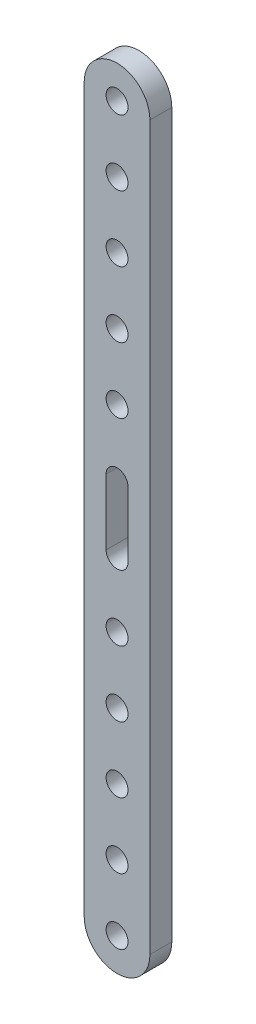
ISO-10303-21;
HEADER;
FILE_DESCRIPTION(('STEP AP214'),'2;1');
FILE_NAME('part.step','',(''),(''),'','','');
FILE_SCHEMA(('AUTOMOTIVE_DESIGN { 1 0 10303 214 1 1 1 1 }'));
ENDSEC;
DATA;
#1=APPLICATION_CONTEXT('core data for automotive mechanical design processes');
#2=APPLICATION_PROTOCOL_DEFINITION('international standard','automotive_design',2000,#1);
#3=PRODUCT_CONTEXT('',#1,'mechanical');
#4=PRODUCT('Part','Part','',(#3));
#5=PRODUCT_RELATED_PRODUCT_CATEGORY('part','',(#4));
#6=PRODUCT_DEFINITION_FORMATION('','',#4);
#7=PRODUCT_DEFINITION_CONTEXT('part definition',#1,'design');
#8=PRODUCT_DEFINITION('design','',#6,#7);
#9=PRODUCT_DEFINITION_SHAPE('','',#8);
#10=(LENGTH_UNIT() NAMED_UNIT(*) SI_UNIT(.MILLI.,.METRE.));
#11=(NAMED_UNIT(*) PLANE_ANGLE_UNIT() SI_UNIT($,.RADIAN.));
#12=(NAMED_UNIT(*) SI_UNIT($,.STERADIAN.) SOLID_ANGLE_UNIT());
#13=UNCERTAINTY_MEASURE_WITH_UNIT(LENGTH_MEASURE(1.E-05),#10,'distance_accuracy_value','');
#14=(GEOMETRIC_REPRESENTATION_CONTEXT(3) GLOBAL_UNCERTAINTY_ASSIGNED_CONTEXT((#13)) GLOBAL_UNIT_ASSIGNED_CONTEXT((#10,
#11,#12)) REPRESENTATION_CONTEXT('',''));
#15=CARTESIAN_POINT('',(0.,0.,0.));
#16=DIRECTION('',(0.,0.,1.));
#17=DIRECTION('',(1.,0.,0.));
#18=AXIS2_PLACEMENT_3D('',#15,#16,#17);
#19=CARTESIAN_POINT('',(208.7507761496,89.428489513,3.));
#20=DIRECTION('',(0.,0.,1.));
#21=DIRECTION('',(1.,0.,0.));
#22=AXIS2_PLACEMENT_3D('',#19,#20,#21);
#23=PLANE('',#22);
#24=CARTESIAN_POINT('',(208.7507761496,107.428489513,3.));
#25=DIRECTION('',(0.,0.,1.));
#26=DIRECTION('',(1.,0.,0.));
#27=AXIS2_PLACEMENT_3D('',#24,#25,#26);
#28=CIRCLE('',#27,1.5);
#29=CARTESIAN_POINT('',(210.2507761496,107.428489513,3.));
#30=VERTEX_POINT('',#29);
#31=EDGE_CURVE('E134',#30,#30,#28,.T.);
#32=ORIENTED_EDGE('',*,*,#31,.F.);
#33=EDGE_LOOP('',(#32));
#34=FACE_BOUND('',#33,.T.);
#35=CARTESIAN_POINT('',(208.7507761496,89.428489513,3.));
#36=DIRECTION('',(0.,0.,1.));
#37=DIRECTION('',(1.,0.,0.));
#38=AXIS2_PLACEMENT_3D('',#35,#36,#37);
#39=CIRCLE('',#38,1.5);
#40=CARTESIAN_POINT('',(210.2507761496,89.428489513,3.));
#41=VERTEX_POINT('',#40);
#42=EDGE_CURVE('E146',#41,#41,#39,.T.);
#43=ORIENTED_EDGE('',*,*,#42,.F.);
#44=EDGE_LOOP('',(#43));
#45=FACE_BOUND('',#44,.T.);
#46=CARTESIAN_POINT('',(208.7507761496,116.428489513,3.));
#47=DIRECTION('',(0.,0.,1.));
#48=DIRECTION('',(1.,0.,0.));
#49=AXIS2_PLACEMENT_3D('',#46,#47,#48);
#50=CIRCLE('',#49,1.5);
#51=CARTESIAN_POINT('',(210.2507761496,116.428489513,3.));
#52=VERTEX_POINT('',#51);
#53=EDGE_CURVE('E158',#52,#52,#50,.T.);
#54=ORIENTED_EDGE('',*,*,#53,.F.);
#55=EDGE_LOOP('',(#54));
#56=FACE_BOUND('',#55,.T.);
#57=CARTESIAN_POINT('',(208.7507761496,161.428489513,3.));
#58=DIRECTION('',(0.,0.,1.));
#59=DIRECTION('',(1.,0.,0.));
#60=AXIS2_PLACEMENT_3D('',#57,#58,#59);
#61=CIRCLE('',#60,1.5);
#62=CARTESIAN_POINT('',(210.2507761496,161.428489513,3.));
#63=VERTEX_POINT('',#62);
#64=EDGE_CURVE('E170',#63,#63,#61,.T.);
#65=ORIENTED_EDGE('',*,*,#64,.F.);
#66=EDGE_LOOP('',(#65));
#67=FACE_BOUND('',#66,.T.);
#68=CARTESIAN_POINT('',(208.7507761496,188.428489513,3.));
#69=DIRECTION('',(0.,0.,1.));
#70=DIRECTION('',(1.,0.,0.));
#71=AXIS2_PLACEMENT_3D('',#68,#69,#70);
#72=CIRCLE('',#71,1.5);
#73=CARTESIAN_POINT('',(210.2507761496,188.428489513,3.));
#74=VERTEX_POINT('',#73);
#75=EDGE_CURVE('E182',#74,#74,#72,.T.);
#76=ORIENTED_EDGE('',*,*,#75,.F.);
#77=EDGE_LOOP('',(#76));
#78=FACE_BOUND('',#77,.T.);
#79=CARTESIAN_POINT('',(208.7507761496,89.428489513,3.));
#80=DIRECTION('',(0.,0.,1.));
#81=DIRECTION('',(1.,0.,0.));
#82=AXIS2_PLACEMENT_3D('',#79,#80,#81);
#83=CIRCLE('',#82,4.5);
#84=CARTESIAN_POINT('',(204.2507761496,89.428489513,3.));
#85=VERTEX_POINT('',#84);
#86=CARTESIAN_POINT('',(213.2507761496,89.428489513,3.));
#87=VERTEX_POINT('',#86);
#88=EDGE_CURVE('E194',#85,#87,#83,.T.);
#89=ORIENTED_EDGE('',*,*,#88,.T.);
#90=DIRECTION('',(0.,1.,0.));
#91=VECTOR('',#90,1.);
#92=CARTESIAN_POINT('',(213.2507761496,89.428489513,3.));
#93=LINE('',#92,#91);
#94=CARTESIAN_POINT('',(213.2507761496,188.428489513,3.));
#95=VERTEX_POINT('',#94);
#96=EDGE_CURVE('E197',#87,#95,#93,.T.);
#97=ORIENTED_EDGE('',*,*,#96,.T.);
#98=CARTESIAN_POINT('',(208.7507761496,188.428489513,3.));
#99=DIRECTION('',(0.,0.,1.));
#100=DIRECTION('',(1.,0.,0.));
#101=AXIS2_PLACEMENT_3D('',#98,#99,#100);
#102=CIRCLE('',#101,4.5);
#103=CARTESIAN_POINT('',(204.2507761496,188.428489513,3.));
#104=VERTEX_POINT('',#103);
#105=EDGE_CURVE('E200',#95,#104,#102,.T.);
#106=ORIENTED_EDGE('',*,*,#105,.T.);
#107=DIRECTION('',(0.,-1.,0.));
#108=VECTOR('',#107,1.);
#109=CARTESIAN_POINT('',(204.2507761496,188.428489513,3.));
#110=LINE('',#109,#108);
#111=EDGE_CURVE('E202',#104,#85,#110,.T.);
#112=ORIENTED_EDGE('',*,*,#111,.T.);
#113=EDGE_LOOP('',(#89,#97,#106,#112));
#114=FACE_BOUND('',#113,.T.);
#115=CARTESIAN_POINT('',(208.7507761496,179.428489513,3.));
#116=DIRECTION('',(0.,0.,1.));
#117=DIRECTION('',(1.,0.,0.));
#118=AXIS2_PLACEMENT_3D('',#115,#116,#117);
#119=CIRCLE('',#118,1.5);
#120=CARTESIAN_POINT('',(210.2507761496,179.428489513,3.));
#121=VERTEX_POINT('',#120);
#122=EDGE_CURVE('E188',#121,#121,#119,.T.);
#123=ORIENTED_EDGE('',*,*,#122,.F.);
#124=EDGE_LOOP('',(#123));
#125=FACE_BOUND('',#124,.T.);
#126=CARTESIAN_POINT('',(208.7507761496,152.428489513,3.));
#127=DIRECTION('',(0.,0.,1.));
#128=DIRECTION('',(1.,0.,0.));
#129=AXIS2_PLACEMENT_3D('',#126,#127,#128);
#130=CIRCLE('',#129,1.5);
#131=CARTESIAN_POINT('',(210.2507761496,152.428489513,3.));
#132=VERTEX_POINT('',#131);
#133=EDGE_CURVE('E176',#132,#132,#130,.T.);
#134=ORIENTED_EDGE('',*,*,#133,.F.);
#135=EDGE_LOOP('',(#134));
#136=FACE_BOUND('',#135,.T.);
#137=CARTESIAN_POINT('',(208.7507761496,170.428489513,3.));
#138=DIRECTION('',(0.,0.,1.));
#139=DIRECTION('',(1.,0.,0.));
#140=AXIS2_PLACEMENT_3D('',#137,#138,#139);
#141=CIRCLE('',#140,1.5);
#142=CARTESIAN_POINT('',(210.2507761496,170.428489513,3.));
#143=VERTEX_POINT('',#142);
#144=EDGE_CURVE('E164',#143,#143,#141,.T.);
#145=ORIENTED_EDGE('',*,*,#144,.F.);
#146=EDGE_LOOP('',(#145));
#147=FACE_BOUND('',#146,.T.);
#148=CARTESIAN_POINT('',(208.7507761496,125.428489513,3.));
#149=DIRECTION('',(0.,0.,1.));
#150=DIRECTION('',(1.,0.,0.));
#151=AXIS2_PLACEMENT_3D('',#148,#149,#150);
#152=CIRCLE('',#151,1.5);
#153=CARTESIAN_POINT('',(210.2507761496,125.428489513,3.));
#154=VERTEX_POINT('',#153);
#155=EDGE_CURVE('E152',#154,#154,#152,.T.);
#156=ORIENTED_EDGE('',*,*,#155,.F.);
#157=EDGE_LOOP('',(#156));
#158=FACE_BOUND('',#157,.T.);
#159=CARTESIAN_POINT('',(208.7507761496,98.428489513,3.));
#160=DIRECTION('',(0.,0.,1.));
#161=DIRECTION('',(1.,0.,0.));
#162=AXIS2_PLACEMENT_3D('',#159,#160,#161);
#163=CIRCLE('',#162,1.5);
#164=CARTESIAN_POINT('',(210.2507761496,98.428489513,3.));
#165=VERTEX_POINT('',#164);
#166=EDGE_CURVE('E140',#165,#165,#163,.T.);
#167=ORIENTED_EDGE('',*,*,#166,.F.);
#168=EDGE_LOOP('',(#167));
#169=FACE_BOUND('',#168,.T.);
#170=DIRECTION('',(0.,1.,0.));
#171=VECTOR('',#170,1.);
#172=CARTESIAN_POINT('',(210.2507761496,143.428489513,3.));
#173=LINE('',#172,#171);
#174=CARTESIAN_POINT('',(210.2507761496,134.428489513,3.));
#175=VERTEX_POINT('',#174);
#176=CARTESIAN_POINT('',(210.2507761496,143.428489513,3.));
#177=VERTEX_POINT('',#176);
#178=EDGE_CURVE('E106',#175,#177,#173,.T.);
#179=ORIENTED_EDGE('',*,*,#178,.F.);
#180=CARTESIAN_POINT('',(208.7507761496,134.428489513,3.));
#181=DIRECTION('',(0.,0.,1.));
#182=DIRECTION('',(1.,0.,0.));
#183=AXIS2_PLACEMENT_3D('',#180,#181,#182);
#184=CIRCLE('',#183,1.5);
#185=CARTESIAN_POINT('',(207.2507761496,134.428489513,3.));
#186=VERTEX_POINT('',#185);
#187=EDGE_CURVE('E98',#186,#175,#184,.T.);
#188=ORIENTED_EDGE('',*,*,#187,.F.);
#189=DIRECTION('',(0.,-1.,0.));
#190=VECTOR('',#189,1.);
#191=CARTESIAN_POINT('',(207.2507761496,134.428489513,3.));
#192=LINE('',#191,#190);
#193=CARTESIAN_POINT('',(207.2507761496,143.428489513,3.));
#194=VERTEX_POINT('',#193);
#195=EDGE_CURVE('E120',#194,#186,#192,.T.);
#196=ORIENTED_EDGE('',*,*,#195,.F.);
#197=CARTESIAN_POINT('',(208.7507761496,143.428489513,3.));
#198=DIRECTION('',(0.,0.,1.));
#199=DIRECTION('',(1.,0.,0.));
#200=AXIS2_PLACEMENT_3D('',#197,#198,#199);
#201=CIRCLE('',#200,1.5);
#202=EDGE_CURVE('E118',#177,#194,#201,.T.);
#203=ORIENTED_EDGE('',*,*,#202,.F.);
#204=EDGE_LOOP('',(#179,#188,#196,#203));
#205=FACE_BOUND('',#204,.T.);
#206=ADVANCED_FACE('F33',(#34,#45,#56,#67,#78,#114,#125,#136,#147,#158,#169,#205),#23,.T.);
#207=CARTESIAN_POINT('',(208.7507761496,89.428489513,0.));
#208=DIRECTION('',(0.,0.,1.));
#209=DIRECTION('',(1.,0.,0.));
#210=AXIS2_PLACEMENT_3D('',#207,#208,#209);
#211=PLANE('',#210);
#212=CARTESIAN_POINT('',(208.7507761496,107.428489513,0.));
#213=DIRECTION('',(0.,0.,1.));
#214=DIRECTION('',(1.,0.,0.));
#215=AXIS2_PLACEMENT_3D('',#212,#213,#214);
#216=CIRCLE('',#215,1.5);
#217=CARTESIAN_POINT('',(210.2507761496,107.428489513,0.));
#218=VERTEX_POINT('',#217);
#219=EDGE_CURVE('E114',#218,#218,#216,.T.);
#220=ORIENTED_EDGE('',*,*,#219,.T.);
#221=EDGE_LOOP('',(#220));
#222=FACE_BOUND('',#221,.T.);
#223=CARTESIAN_POINT('',(208.7507761496,89.428489513,0.));
#224=DIRECTION('',(0.,0.,1.));
#225=DIRECTION('',(1.,0.,0.));
#226=AXIS2_PLACEMENT_3D('',#223,#224,#225);
#227=CIRCLE('',#226,1.5);
#228=CARTESIAN_POINT('',(210.2507761496,89.428489513,0.));
#229=VERTEX_POINT('',#228);
#230=EDGE_CURVE('E143',#229,#229,#227,.T.);
#231=ORIENTED_EDGE('',*,*,#230,.T.);
#232=EDGE_LOOP('',(#231));
#233=FACE_BOUND('',#232,.T.);
#234=CARTESIAN_POINT('',(208.7507761496,116.428489513,0.));
#235=DIRECTION('',(0.,0.,1.));
#236=DIRECTION('',(1.,0.,0.));
#237=AXIS2_PLACEMENT_3D('',#234,#235,#236);
#238=CIRCLE('',#237,1.5);
#239=CARTESIAN_POINT('',(210.2507761496,116.428489513,0.));
#240=VERTEX_POINT('',#239);
#241=EDGE_CURVE('E155',#240,#240,#238,.T.);
#242=ORIENTED_EDGE('',*,*,#241,.T.);
#243=EDGE_LOOP('',(#242));
#244=FACE_BOUND('',#243,.T.);
#245=CARTESIAN_POINT('',(208.7507761496,161.428489513,0.));
#246=DIRECTION('',(0.,0.,1.));
#247=DIRECTION('',(1.,0.,0.));
#248=AXIS2_PLACEMENT_3D('',#245,#246,#247);
#249=CIRCLE('',#248,1.5);
#250=CARTESIAN_POINT('',(210.2507761496,161.428489513,0.));
#251=VERTEX_POINT('',#250);
#252=EDGE_CURVE('E167',#251,#251,#249,.T.);
#253=ORIENTED_EDGE('',*,*,#252,.T.);
#254=EDGE_LOOP('',(#253));
#255=FACE_BOUND('',#254,.T.);
#256=CARTESIAN_POINT('',(208.7507761496,188.428489513,0.));
#257=DIRECTION('',(0.,0.,1.));
#258=DIRECTION('',(1.,0.,0.));
#259=AXIS2_PLACEMENT_3D('',#256,#257,#258);
#260=CIRCLE('',#259,1.5);
#261=CARTESIAN_POINT('',(210.2507761496,188.428489513,0.));
#262=VERTEX_POINT('',#261);
#263=EDGE_CURVE('E179',#262,#262,#260,.T.);
#264=ORIENTED_EDGE('',*,*,#263,.T.);
#265=EDGE_LOOP('',(#264));
#266=FACE_BOUND('',#265,.T.);
#267=CARTESIAN_POINT('',(208.7507761496,89.428489513,0.));
#268=DIRECTION('',(0.,0.,1.));
#269=DIRECTION('',(1.,0.,0.));
#270=AXIS2_PLACEMENT_3D('',#267,#268,#269);
#271=CIRCLE('',#270,4.5);
#272=CARTESIAN_POINT('',(204.2507761496,89.428489513,0.));
#273=VERTEX_POINT('',#272);
#274=CARTESIAN_POINT('',(213.2507761496,89.428489513,0.));
#275=VERTEX_POINT('',#274);
#276=EDGE_CURVE('E191',#273,#275,#271,.T.);
#277=ORIENTED_EDGE('',*,*,#276,.F.);
#278=DIRECTION('',(0.,-1.,0.));
#279=VECTOR('',#278,1.);
#280=CARTESIAN_POINT('',(204.2507761496,188.428489513,0.));
#281=LINE('',#280,#279);
#282=CARTESIAN_POINT('',(204.2507761496,188.428489513,0.));
#283=VERTEX_POINT('',#282);
#284=EDGE_CURVE('E198',#283,#273,#281,.T.);
#285=ORIENTED_EDGE('',*,*,#284,.F.);
#286=CARTESIAN_POINT('',(208.7507761496,188.428489513,0.));
#287=DIRECTION('',(0.,0.,1.));
#288=DIRECTION('',(1.,0.,0.));
#289=AXIS2_PLACEMENT_3D('',#286,#287,#288);
#290=CIRCLE('',#289,4.5);
#291=CARTESIAN_POINT('',(213.2507761496,188.428489513,0.));
#292=VERTEX_POINT('',#291);
#293=EDGE_CURVE('E209',#292,#283,#290,.T.);
#294=ORIENTED_EDGE('',*,*,#293,.F.);
#295=DIRECTION('',(0.,1.,0.));
#296=VECTOR('',#295,1.);
#297=CARTESIAN_POINT('',(213.2507761496,89.428489513,0.));
#298=LINE('',#297,#296);
#299=EDGE_CURVE('E207',#275,#292,#298,.T.);
#300=ORIENTED_EDGE('',*,*,#299,.F.);
#301=EDGE_LOOP('',(#277,#285,#294,#300));
#302=FACE_BOUND('',#301,.T.);
#303=CARTESIAN_POINT('',(208.7507761496,179.428489513,0.));
#304=DIRECTION('',(0.,0.,1.));
#305=DIRECTION('',(1.,0.,0.));
#306=AXIS2_PLACEMENT_3D('',#303,#304,#305);
#307=CIRCLE('',#306,1.5);
#308=CARTESIAN_POINT('',(210.2507761496,179.428489513,0.));
#309=VERTEX_POINT('',#308);
#310=EDGE_CURVE('E185',#309,#309,#307,.T.);
#311=ORIENTED_EDGE('',*,*,#310,.T.);
#312=EDGE_LOOP('',(#311));
#313=FACE_BOUND('',#312,.T.);
#314=CARTESIAN_POINT('',(208.7507761496,152.428489513,0.));
#315=DIRECTION('',(0.,0.,1.));
#316=DIRECTION('',(1.,0.,0.));
#317=AXIS2_PLACEMENT_3D('',#314,#315,#316);
#318=CIRCLE('',#317,1.5);
#319=CARTESIAN_POINT('',(210.2507761496,152.428489513,0.));
#320=VERTEX_POINT('',#319);
#321=EDGE_CURVE('E173',#320,#320,#318,.T.);
#322=ORIENTED_EDGE('',*,*,#321,.T.);
#323=EDGE_LOOP('',(#322));
#324=FACE_BOUND('',#323,.T.);
#325=CARTESIAN_POINT('',(208.7507761496,170.428489513,0.));
#326=DIRECTION('',(0.,0.,1.));
#327=DIRECTION('',(1.,0.,0.));
#328=AXIS2_PLACEMENT_3D('',#325,#326,#327);
#329=CIRCLE('',#328,1.5);
#330=CARTESIAN_POINT('',(210.2507761496,170.428489513,0.));
#331=VERTEX_POINT('',#330);
#332=EDGE_CURVE('E161',#331,#331,#329,.T.);
#333=ORIENTED_EDGE('',*,*,#332,.T.);
#334=EDGE_LOOP('',(#333));
#335=FACE_BOUND('',#334,.T.);
#336=CARTESIAN_POINT('',(208.7507761496,125.428489513,0.));
#337=DIRECTION('',(0.,0.,1.));
#338=DIRECTION('',(1.,0.,0.));
#339=AXIS2_PLACEMENT_3D('',#336,#337,#338);
#340=CIRCLE('',#339,1.5);
#341=CARTESIAN_POINT('',(210.2507761496,125.428489513,0.));
#342=VERTEX_POINT('',#341);
#343=EDGE_CURVE('E149',#342,#342,#340,.T.);
#344=ORIENTED_EDGE('',*,*,#343,.T.);
#345=EDGE_LOOP('',(#344));
#346=FACE_BOUND('',#345,.T.);
#347=CARTESIAN_POINT('',(208.7507761496,98.428489513,0.));
#348=DIRECTION('',(0.,0.,1.));
#349=DIRECTION('',(1.,0.,0.));
#350=AXIS2_PLACEMENT_3D('',#347,#348,#349);
#351=CIRCLE('',#350,1.5);
#352=CARTESIAN_POINT('',(210.2507761496,98.428489513,0.));
#353=VERTEX_POINT('',#352);
#354=EDGE_CURVE('E137',#353,#353,#351,.T.);
#355=ORIENTED_EDGE('',*,*,#354,.T.);
#356=EDGE_LOOP('',(#355));
#357=FACE_BOUND('',#356,.T.);
#358=CARTESIAN_POINT('',(208.7507761496,134.428489513,0.));
#359=DIRECTION('',(0.,0.,1.));
#360=DIRECTION('',(1.,0.,0.));
#361=AXIS2_PLACEMENT_3D('',#358,#359,#360);
#362=CIRCLE('',#361,1.5);
#363=CARTESIAN_POINT('',(207.2507761496,134.428489513,0.));
#364=VERTEX_POINT('',#363);
#365=CARTESIAN_POINT('',(210.2507761496,134.428489513,0.));
#366=VERTEX_POINT('',#365);
#367=EDGE_CURVE('E56',#364,#366,#362,.T.);
#368=ORIENTED_EDGE('',*,*,#367,.T.);
#369=DIRECTION('',(0.,1.,0.));
#370=VECTOR('',#369,1.);
#371=CARTESIAN_POINT('',(210.2507761496,143.428489513,0.));
#372=LINE('',#371,#370);
#373=CARTESIAN_POINT('',(210.2507761496,143.428489513,0.));
#374=VERTEX_POINT('',#373);
#375=EDGE_CURVE('E113',#366,#374,#372,.T.);
#376=ORIENTED_EDGE('',*,*,#375,.T.);
#377=CARTESIAN_POINT('',(208.7507761496,143.428489513,0.));
#378=DIRECTION('',(0.,0.,1.));
#379=DIRECTION('',(1.,0.,0.));
#380=AXIS2_PLACEMENT_3D('',#377,#378,#379);
#381=CIRCLE('',#380,1.5);
#382=CARTESIAN_POINT('',(207.2507761496,143.428489513,0.));
#383=VERTEX_POINT('',#382);
#384=EDGE_CURVE('E126',#374,#383,#381,.T.);
#385=ORIENTED_EDGE('',*,*,#384,.T.);
#386=DIRECTION('',(0.,-1.,0.));
#387=VECTOR('',#386,1.);
#388=CARTESIAN_POINT('',(207.2507761496,134.428489513,0.));
#389=LINE('',#388,#387);
#390=EDGE_CURVE('E107',#383,#364,#389,.T.);
#391=ORIENTED_EDGE('',*,*,#390,.T.);
#392=EDGE_LOOP('',(#368,#376,#385,#391));
#393=FACE_BOUND('',#392,.T.);
#394=ADVANCED_FACE('F227',(#222,#233,#244,#255,#266,#302,#313,#324,#335,#346,#357,#393),#211,.F.);
#395=CARTESIAN_POINT('',(208.7507761496,89.428489513,3.));
#396=DIRECTION('',(0.,0.,-1.));
#397=DIRECTION('',(-1.,0.,0.));
#398=AXIS2_PLACEMENT_3D('',#395,#396,#397);
#399=CYLINDRICAL_SURFACE('',#398,4.5);
#400=ORIENTED_EDGE('',*,*,#276,.T.);
#401=DIRECTION('',(0.,0.,-1.));
#402=VECTOR('',#401,1.);
#403=CARTESIAN_POINT('',(213.2507761496,89.428489513,3.));
#404=LINE('',#403,#402);
#405=EDGE_CURVE('E11',#87,#275,#404,.T.);
#406=ORIENTED_EDGE('',*,*,#405,.F.);
#407=ORIENTED_EDGE('',*,*,#88,.F.);
#408=DIRECTION('',(0.,0.,-1.));
#409=VECTOR('',#408,1.);
#410=CARTESIAN_POINT('',(204.2507761496,89.428489513,3.));
#411=LINE('',#410,#409);
#412=EDGE_CURVE('E204',#85,#273,#411,.T.);
#413=ORIENTED_EDGE('',*,*,#412,.T.);
#414=EDGE_LOOP('',(#400,#406,#407,#413));
#415=FACE_BOUND('',#414,.T.);
#416=ADVANCED_FACE('F35',(#415),#399,.T.);
#417=CARTESIAN_POINT('',(213.2507761496,89.428489513,3.));
#418=DIRECTION('',(-1.,0.,0.));
#419=DIRECTION('',(0.,0.,1.));
#420=AXIS2_PLACEMENT_3D('',#417,#418,#419);
#421=PLANE('',#420);
#422=ORIENTED_EDGE('',*,*,#299,.T.);
#423=DIRECTION('',(0.,0.,-1.));
#424=VECTOR('',#423,1.);
#425=CARTESIAN_POINT('',(213.2507761496,188.428489513,3.));
#426=LINE('',#425,#424);
#427=EDGE_CURVE('E41',#95,#292,#426,.T.);
#428=ORIENTED_EDGE('',*,*,#427,.F.);
#429=ORIENTED_EDGE('',*,*,#96,.F.);
#430=ORIENTED_EDGE('',*,*,#405,.T.);
#431=EDGE_LOOP('',(#422,#428,#429,#430));
#432=FACE_BOUND('',#431,.T.);
#433=ADVANCED_FACE('F238',(#432),#421,.F.);
#434=CARTESIAN_POINT('',(208.7507761496,188.428489513,3.));
#435=DIRECTION('',(0.,0.,-1.));
#436=DIRECTION('',(-1.,0.,0.));
#437=AXIS2_PLACEMENT_3D('',#434,#435,#436);
#438=CYLINDRICAL_SURFACE('',#437,4.5);
#439=ORIENTED_EDGE('',*,*,#293,.T.);
#440=DIRECTION('',(0.,0.,-1.));
#441=VECTOR('',#440,1.);
#442=CARTESIAN_POINT('',(204.2507761496,188.428489513,3.));
#443=LINE('',#442,#441);
#444=EDGE_CURVE('E214',#104,#283,#443,.T.);
#445=ORIENTED_EDGE('',*,*,#444,.F.);
#446=ORIENTED_EDGE('',*,*,#105,.F.);
#447=ORIENTED_EDGE('',*,*,#427,.T.);
#448=EDGE_LOOP('',(#439,#445,#446,#447));
#449=FACE_BOUND('',#448,.T.);
#450=ADVANCED_FACE('F221',(#449),#438,.T.);
#451=CARTESIAN_POINT('',(204.2507761496,188.428489513,3.));
#452=DIRECTION('',(1.,0.,0.));
#453=DIRECTION('',(0.,0.,-1.));
#454=AXIS2_PLACEMENT_3D('',#451,#452,#453);
#455=PLANE('',#454);
#456=ORIENTED_EDGE('',*,*,#284,.T.);
#457=ORIENTED_EDGE('',*,*,#412,.F.);
#458=ORIENTED_EDGE('',*,*,#111,.F.);
#459=ORIENTED_EDGE('',*,*,#444,.T.);
#460=EDGE_LOOP('',(#456,#457,#458,#459));
#461=FACE_BOUND('',#460,.T.);
#462=ADVANCED_FACE('F231',(#461),#455,.F.);
#463=CARTESIAN_POINT('',(208.7507761496,179.428489513,3.));
#464=DIRECTION('',(0.,0.,-1.));
#465=DIRECTION('',(-1.,0.,0.));
#466=AXIS2_PLACEMENT_3D('',#463,#464,#465);
#467=CYLINDRICAL_SURFACE('',#466,1.5);
#468=ORIENTED_EDGE('',*,*,#122,.T.);
#469=EDGE_LOOP('',(#468));
#470=FACE_BOUND('',#469,.T.);
#471=ORIENTED_EDGE('',*,*,#310,.F.);
#472=EDGE_LOOP('',(#471));
#473=FACE_BOUND('',#472,.T.);
#474=ADVANCED_FACE('F256',(#470,#473),#467,.F.);
#475=CARTESIAN_POINT('',(208.7507761496,188.428489513,3.));
#476=DIRECTION('',(0.,0.,-1.));
#477=DIRECTION('',(-1.,0.,0.));
#478=AXIS2_PLACEMENT_3D('',#475,#476,#477);
#479=CYLINDRICAL_SURFACE('',#478,1.5);
#480=ORIENTED_EDGE('',*,*,#75,.T.);
#481=EDGE_LOOP('',(#480));
#482=FACE_BOUND('',#481,.T.);
#483=ORIENTED_EDGE('',*,*,#263,.F.);
#484=EDGE_LOOP('',(#483));
#485=FACE_BOUND('',#484,.T.);
#486=ADVANCED_FACE('F263',(#482,#485),#479,.F.);
#487=CARTESIAN_POINT('',(208.7507761496,152.428489513,3.));
#488=DIRECTION('',(0.,0.,-1.));
#489=DIRECTION('',(-1.,0.,0.));
#490=AXIS2_PLACEMENT_3D('',#487,#488,#489);
#491=CYLINDRICAL_SURFACE('',#490,1.5);
#492=ORIENTED_EDGE('',*,*,#133,.T.);
#493=EDGE_LOOP('',(#492));
#494=FACE_BOUND('',#493,.T.);
#495=ORIENTED_EDGE('',*,*,#321,.F.);
#496=EDGE_LOOP('',(#495));
#497=FACE_BOUND('',#496,.T.);
#498=ADVANCED_FACE('F268',(#494,#497),#491,.F.);
#499=CARTESIAN_POINT('',(208.7507761496,161.428489513,3.));
#500=DIRECTION('',(0.,0.,-1.));
#501=DIRECTION('',(-1.,0.,0.));
#502=AXIS2_PLACEMENT_3D('',#499,#500,#501);
#503=CYLINDRICAL_SURFACE('',#502,1.5);
#504=ORIENTED_EDGE('',*,*,#64,.T.);
#505=EDGE_LOOP('',(#504));
#506=FACE_BOUND('',#505,.T.);
#507=ORIENTED_EDGE('',*,*,#252,.F.);
#508=EDGE_LOOP('',(#507));
#509=FACE_BOUND('',#508,.T.);
#510=ADVANCED_FACE('F320',(#506,#509),#503,.F.);
#511=CARTESIAN_POINT('',(208.7507761496,170.428489513,3.));
#512=DIRECTION('',(0.,0.,-1.));
#513=DIRECTION('',(-1.,0.,0.));
#514=AXIS2_PLACEMENT_3D('',#511,#512,#513);
#515=CYLINDRICAL_SURFACE('',#514,1.5);
#516=ORIENTED_EDGE('',*,*,#144,.T.);
#517=EDGE_LOOP('',(#516));
#518=FACE_BOUND('',#517,.T.);
#519=ORIENTED_EDGE('',*,*,#332,.F.);
#520=EDGE_LOOP('',(#519));
#521=FACE_BOUND('',#520,.T.);
#522=ADVANCED_FACE('F316',(#518,#521),#515,.F.);
#523=CARTESIAN_POINT('',(208.7507761496,116.428489513,3.));
#524=DIRECTION('',(0.,0.,-1.));
#525=DIRECTION('',(-1.,0.,0.));
#526=AXIS2_PLACEMENT_3D('',#523,#524,#525);
#527=CYLINDRICAL_SURFACE('',#526,1.5);
#528=ORIENTED_EDGE('',*,*,#53,.T.);
#529=EDGE_LOOP('',(#528));
#530=FACE_BOUND('',#529,.T.);
#531=ORIENTED_EDGE('',*,*,#241,.F.);
#532=EDGE_LOOP('',(#531));
#533=FACE_BOUND('',#532,.T.);
#534=ADVANCED_FACE('F312',(#530,#533),#527,.F.);
#535=CARTESIAN_POINT('',(208.7507761496,125.428489513,3.));
#536=DIRECTION('',(0.,0.,-1.));
#537=DIRECTION('',(-1.,0.,0.));
#538=AXIS2_PLACEMENT_3D('',#535,#536,#537);
#539=CYLINDRICAL_SURFACE('',#538,1.5);
#540=ORIENTED_EDGE('',*,*,#155,.T.);
#541=EDGE_LOOP('',(#540));
#542=FACE_BOUND('',#541,.T.);
#543=ORIENTED_EDGE('',*,*,#343,.F.);
#544=EDGE_LOOP('',(#543));
#545=FACE_BOUND('',#544,.T.);
#546=ADVANCED_FACE('F308',(#542,#545),#539,.F.);
#547=CARTESIAN_POINT('',(208.7507761496,89.428489513,3.));
#548=DIRECTION('',(0.,0.,-1.));
#549=DIRECTION('',(-1.,0.,0.));
#550=AXIS2_PLACEMENT_3D('',#547,#548,#549);
#551=CYLINDRICAL_SURFACE('',#550,1.5);
#552=ORIENTED_EDGE('',*,*,#42,.T.);
#553=EDGE_LOOP('',(#552));
#554=FACE_BOUND('',#553,.T.);
#555=ORIENTED_EDGE('',*,*,#230,.F.);
#556=EDGE_LOOP('',(#555));
#557=FACE_BOUND('',#556,.T.);
#558=ADVANCED_FACE('F304',(#554,#557),#551,.F.);
#559=CARTESIAN_POINT('',(208.7507761496,98.428489513,3.));
#560=DIRECTION('',(0.,0.,-1.));
#561=DIRECTION('',(-1.,0.,0.));
#562=AXIS2_PLACEMENT_3D('',#559,#560,#561);
#563=CYLINDRICAL_SURFACE('',#562,1.5);
#564=ORIENTED_EDGE('',*,*,#166,.T.);
#565=EDGE_LOOP('',(#564));
#566=FACE_BOUND('',#565,.T.);
#567=ORIENTED_EDGE('',*,*,#354,.F.);
#568=EDGE_LOOP('',(#567));
#569=FACE_BOUND('',#568,.T.);
#570=ADVANCED_FACE('F300',(#566,#569),#563,.F.);
#571=CARTESIAN_POINT('',(208.7507761496,107.428489513,3.));
#572=DIRECTION('',(0.,0.,-1.));
#573=DIRECTION('',(-1.,0.,0.));
#574=AXIS2_PLACEMENT_3D('',#571,#572,#573);
#575=CYLINDRICAL_SURFACE('',#574,1.5);
#576=ORIENTED_EDGE('',*,*,#31,.T.);
#577=EDGE_LOOP('',(#576));
#578=FACE_BOUND('',#577,.T.);
#579=ORIENTED_EDGE('',*,*,#219,.F.);
#580=EDGE_LOOP('',(#579));
#581=FACE_BOUND('',#580,.T.);
#582=ADVANCED_FACE('F297',(#578,#581),#575,.F.);
#583=CARTESIAN_POINT('',(208.7507761496,134.428489513,3.));
#584=DIRECTION('',(0.,0.,-1.));
#585=DIRECTION('',(-1.,0.,0.));
#586=AXIS2_PLACEMENT_3D('',#583,#584,#585);
#587=CYLINDRICAL_SURFACE('',#586,1.5);
#588=ORIENTED_EDGE('',*,*,#367,.F.);
#589=DIRECTION('',(0.,0.,-1.));
#590=VECTOR('',#589,1.);
#591=CARTESIAN_POINT('',(207.2507761496,134.428489513,3.));
#592=LINE('',#591,#590);
#593=EDGE_CURVE('E102',#186,#364,#592,.T.);
#594=ORIENTED_EDGE('',*,*,#593,.F.);
#595=ORIENTED_EDGE('',*,*,#187,.T.);
#596=DIRECTION('',(0.,0.,-1.));
#597=VECTOR('',#596,1.);
#598=CARTESIAN_POINT('',(210.2507761496,134.428489513,3.));
#599=LINE('',#598,#597);
#600=EDGE_CURVE('E101',#175,#366,#599,.T.);
#601=ORIENTED_EDGE('',*,*,#600,.T.);
#602=EDGE_LOOP('',(#588,#594,#595,#601));
#603=FACE_BOUND('',#602,.T.);
#604=ADVANCED_FACE('F100',(#603),#587,.F.);
#605=CARTESIAN_POINT('',(210.2507761496,143.428489513,3.));
#606=DIRECTION('',(-1.,0.,0.));
#607=DIRECTION('',(0.,0.,1.));
#608=AXIS2_PLACEMENT_3D('',#605,#606,#607);
#609=PLANE('',#608);
#610=ORIENTED_EDGE('',*,*,#375,.F.);
#611=ORIENTED_EDGE('',*,*,#600,.F.);
#612=ORIENTED_EDGE('',*,*,#178,.T.);
#613=DIRECTION('',(0.,0.,-1.));
#614=VECTOR('',#613,1.);
#615=CARTESIAN_POINT('',(210.2507761496,143.428489513,3.));
#616=LINE('',#615,#614);
#617=EDGE_CURVE('E115',#177,#374,#616,.T.);
#618=ORIENTED_EDGE('',*,*,#617,.T.);
#619=EDGE_LOOP('',(#610,#611,#612,#618));
#620=FACE_BOUND('',#619,.T.);
#621=ADVANCED_FACE('F110',(#620),#609,.T.);
#622=CARTESIAN_POINT('',(208.7507761496,143.428489513,3.));
#623=DIRECTION('',(0.,0.,-1.));
#624=DIRECTION('',(-1.,0.,0.));
#625=AXIS2_PLACEMENT_3D('',#622,#623,#624);
#626=CYLINDRICAL_SURFACE('',#625,1.5);
#627=ORIENTED_EDGE('',*,*,#384,.F.);
#628=ORIENTED_EDGE('',*,*,#617,.F.);
#629=ORIENTED_EDGE('',*,*,#202,.T.);
#630=DIRECTION('',(0.,0.,-1.));
#631=VECTOR('',#630,1.);
#632=CARTESIAN_POINT('',(207.2507761496,143.428489513,3.));
#633=LINE('',#632,#631);
#634=EDGE_CURVE('E48',#194,#383,#633,.T.);
#635=ORIENTED_EDGE('',*,*,#634,.T.);
#636=EDGE_LOOP('',(#627,#628,#629,#635));
#637=FACE_BOUND('',#636,.T.);
#638=ADVANCED_FACE('F285',(#637),#626,.F.);
#639=CARTESIAN_POINT('',(207.2507761496,134.428489513,3.));
#640=DIRECTION('',(1.,0.,0.));
#641=DIRECTION('',(0.,0.,-1.));
#642=AXIS2_PLACEMENT_3D('',#639,#640,#641);
#643=PLANE('',#642);
#644=ORIENTED_EDGE('',*,*,#390,.F.);
#645=ORIENTED_EDGE('',*,*,#634,.F.);
#646=ORIENTED_EDGE('',*,*,#195,.T.);
#647=ORIENTED_EDGE('',*,*,#593,.T.);
#648=EDGE_LOOP('',(#644,#645,#646,#647));
#649=FACE_BOUND('',#648,.T.);
#650=ADVANCED_FACE('F283',(#649),#643,.T.);
#651=CLOSED_SHELL('',(#206,#394,#416,#433,#450,#462,#474,#486,#498,#510,#522,#534,#546,#558,
#570,#582,#604,#621,#638,#650));
#652=MANIFOLD_SOLID_BREP('B2',#651);
#653=ADVANCED_BREP_SHAPE_REPRESENTATION('',(#18,#652),#14);
#654=SHAPE_DEFINITION_REPRESENTATION(#9,#653);
ENDSEC;
END-ISO-10303-21;
